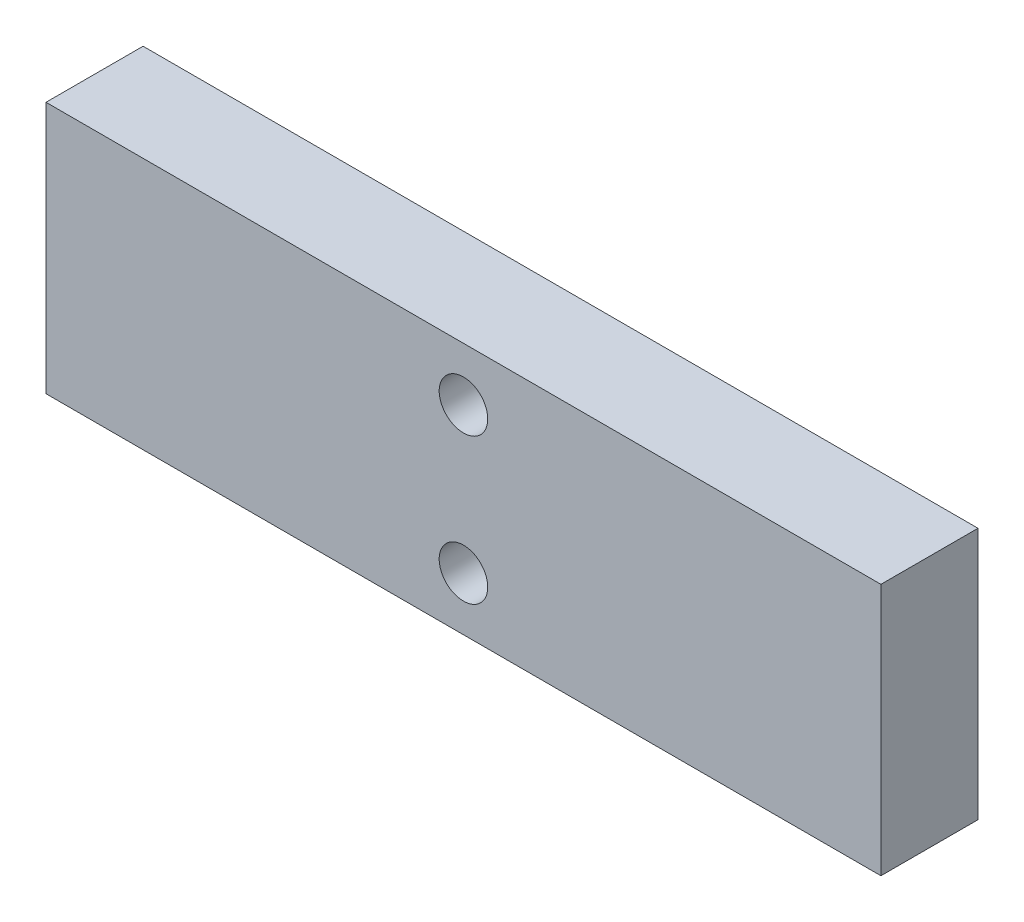
ISO-10303-21;
HEADER;
FILE_DESCRIPTION(('STEP AP214'),'2;1');
FILE_NAME('part.step','',(''),(''),'','','');
FILE_SCHEMA(('AUTOMOTIVE_DESIGN { 1 0 10303 214 1 1 1 1 }'));
ENDSEC;
DATA;
#1=APPLICATION_CONTEXT('core data for automotive mechanical design processes');
#2=APPLICATION_PROTOCOL_DEFINITION('international standard','automotive_design',2000,#1);
#3=PRODUCT_CONTEXT('',#1,'mechanical');
#4=PRODUCT('Part','Part','',(#3));
#5=PRODUCT_RELATED_PRODUCT_CATEGORY('part','',(#4));
#6=PRODUCT_DEFINITION_FORMATION('','',#4);
#7=PRODUCT_DEFINITION_CONTEXT('part definition',#1,'design');
#8=PRODUCT_DEFINITION('design','',#6,#7);
#9=PRODUCT_DEFINITION_SHAPE('','',#8);
#10=(LENGTH_UNIT() NAMED_UNIT(*) SI_UNIT(.MILLI.,.METRE.));
#11=(NAMED_UNIT(*) PLANE_ANGLE_UNIT() SI_UNIT($,.RADIAN.));
#12=(NAMED_UNIT(*) SI_UNIT($,.STERADIAN.) SOLID_ANGLE_UNIT());
#13=UNCERTAINTY_MEASURE_WITH_UNIT(LENGTH_MEASURE(1.E-05),#10,'distance_accuracy_value','');
#14=(GEOMETRIC_REPRESENTATION_CONTEXT(3) GLOBAL_UNCERTAINTY_ASSIGNED_CONTEXT((#13)) GLOBAL_UNIT_ASSIGNED_CONTEXT((#10,
#11,#12)) REPRESENTATION_CONTEXT('',''));
#15=CARTESIAN_POINT('',(0.,0.,0.));
#16=DIRECTION('',(0.,0.,1.));
#17=DIRECTION('',(1.,0.,0.));
#18=AXIS2_PLACEMENT_3D('',#15,#16,#17);
#19=CARTESIAN_POINT('',(0.,0.,10.));
#20=DIRECTION('',(0.,0.,-1.));
#21=DIRECTION('',(-1.,0.,0.));
#22=AXIS2_PLACEMENT_3D('',#19,#20,#21);
#23=PLANE('',#22);
#24=DIRECTION('',(0.,1.,0.));
#25=VECTOR('',#24,1.);
#26=CARTESIAN_POINT('',(43.,-13.,10.));
#27=LINE('',#26,#25);
#28=CARTESIAN_POINT('',(43.,-13.,10.));
#29=VERTEX_POINT('',#28);
#30=CARTESIAN_POINT('',(43.,13.,10.));
#31=VERTEX_POINT('',#30);
#32=EDGE_CURVE('E86',#29,#31,#27,.T.);
#33=ORIENTED_EDGE('',*,*,#32,.T.);
#34=DIRECTION('',(-1.,0.,0.));
#35=VECTOR('',#34,1.);
#36=CARTESIAN_POINT('',(-43.,13.,10.));
#37=LINE('',#36,#35);
#38=CARTESIAN_POINT('',(-43.,13.,10.));
#39=VERTEX_POINT('',#38);
#40=EDGE_CURVE('E81',#31,#39,#37,.T.);
#41=ORIENTED_EDGE('',*,*,#40,.T.);
#42=DIRECTION('',(0.,-1.,0.));
#43=VECTOR('',#42,1.);
#44=CARTESIAN_POINT('',(-43.,-13.,10.));
#45=LINE('',#44,#43);
#46=CARTESIAN_POINT('',(-43.,-13.,10.));
#47=VERTEX_POINT('',#46);
#48=EDGE_CURVE('E84',#39,#47,#45,.T.);
#49=ORIENTED_EDGE('',*,*,#48,.T.);
#50=DIRECTION('',(1.,0.,0.));
#51=VECTOR('',#50,1.);
#52=CARTESIAN_POINT('',(-43.,-13.,10.));
#53=LINE('',#52,#51);
#54=EDGE_CURVE('E51',#47,#29,#53,.T.);
#55=ORIENTED_EDGE('',*,*,#54,.T.);
#56=EDGE_LOOP('',(#33,#41,#49,#55));
#57=FACE_BOUND('',#56,.T.);
#58=CARTESIAN_POINT('',(0.,7.5,10.));
#59=DIRECTION('',(0.,0.,1.));
#60=DIRECTION('',(1.,0.,0.));
#61=AXIS2_PLACEMENT_3D('',#58,#59,#60);
#62=CIRCLE('',#61,2.5);
#63=CARTESIAN_POINT('',(2.5,7.5,10.));
#64=VERTEX_POINT('',#63);
#65=EDGE_CURVE('E101',#64,#64,#62,.T.);
#66=ORIENTED_EDGE('',*,*,#65,.F.);
#67=EDGE_LOOP('',(#66));
#68=FACE_BOUND('',#67,.T.);
#69=CARTESIAN_POINT('',(0.,-7.5,10.));
#70=DIRECTION('',(0.,0.,1.));
#71=DIRECTION('',(1.,0.,0.));
#72=AXIS2_PLACEMENT_3D('',#69,#70,#71);
#73=CIRCLE('',#72,2.5);
#74=CARTESIAN_POINT('',(2.5,-7.5,10.));
#75=VERTEX_POINT('',#74);
#76=EDGE_CURVE('E116',#75,#75,#73,.T.);
#77=ORIENTED_EDGE('',*,*,#76,.F.);
#78=EDGE_LOOP('',(#77));
#79=FACE_BOUND('',#78,.T.);
#80=ADVANCED_FACE('F34',(#57,#68,#79),#23,.F.);
#81=CARTESIAN_POINT('',(0.,0.,0.));
#82=DIRECTION('',(0.,0.,-1.));
#83=DIRECTION('',(-1.,0.,0.));
#84=AXIS2_PLACEMENT_3D('',#81,#82,#83);
#85=PLANE('',#84);
#86=CARTESIAN_POINT('',(0.,7.5,0.));
#87=DIRECTION('',(0.,0.,1.));
#88=DIRECTION('',(1.,0.,0.));
#89=AXIS2_PLACEMENT_3D('',#86,#87,#88);
#90=CIRCLE('',#89,2.5);
#91=CARTESIAN_POINT('',(2.5,7.5,0.));
#92=VERTEX_POINT('',#91);
#93=EDGE_CURVE('E113',#92,#92,#90,.T.);
#94=ORIENTED_EDGE('',*,*,#93,.T.);
#95=EDGE_LOOP('',(#94));
#96=FACE_BOUND('',#95,.T.);
#97=DIRECTION('',(0.,1.,0.));
#98=VECTOR('',#97,1.);
#99=CARTESIAN_POINT('',(43.,-13.,0.));
#100=LINE('',#99,#98);
#101=CARTESIAN_POINT('',(43.,-13.,0.));
#102=VERTEX_POINT('',#101);
#103=CARTESIAN_POINT('',(43.,13.,0.));
#104=VERTEX_POINT('',#103);
#105=EDGE_CURVE('E98',#102,#104,#100,.T.);
#106=ORIENTED_EDGE('',*,*,#105,.F.);
#107=DIRECTION('',(1.,0.,0.));
#108=VECTOR('',#107,1.);
#109=CARTESIAN_POINT('',(-43.,-13.,0.));
#110=LINE('',#109,#108);
#111=CARTESIAN_POINT('',(-43.,-13.,0.));
#112=VERTEX_POINT('',#111);
#113=EDGE_CURVE('E74',#112,#102,#110,.T.);
#114=ORIENTED_EDGE('',*,*,#113,.F.);
#115=DIRECTION('',(0.,-1.,0.));
#116=VECTOR('',#115,1.);
#117=CARTESIAN_POINT('',(-43.,-13.,0.));
#118=LINE('',#117,#116);
#119=CARTESIAN_POINT('',(-43.,13.,0.));
#120=VERTEX_POINT('',#119);
#121=EDGE_CURVE('E68',#120,#112,#118,.T.);
#122=ORIENTED_EDGE('',*,*,#121,.F.);
#123=DIRECTION('',(-1.,0.,0.));
#124=VECTOR('',#123,1.);
#125=CARTESIAN_POINT('',(-43.,13.,0.));
#126=LINE('',#125,#124);
#127=EDGE_CURVE('E90',#104,#120,#126,.T.);
#128=ORIENTED_EDGE('',*,*,#127,.F.);
#129=EDGE_LOOP('',(#106,#114,#122,#128));
#130=FACE_BOUND('',#129,.T.);
#131=CARTESIAN_POINT('',(0.,-7.5,0.));
#132=DIRECTION('',(0.,0.,1.));
#133=DIRECTION('',(1.,0.,0.));
#134=AXIS2_PLACEMENT_3D('',#131,#132,#133);
#135=CIRCLE('',#134,2.5);
#136=CARTESIAN_POINT('',(2.5,-7.5,0.));
#137=VERTEX_POINT('',#136);
#138=EDGE_CURVE('E119',#137,#137,#135,.T.);
#139=ORIENTED_EDGE('',*,*,#138,.T.);
#140=EDGE_LOOP('',(#139));
#141=FACE_BOUND('',#140,.T.);
#142=ADVANCED_FACE('F109',(#96,#130,#141),#85,.T.);
#143=CARTESIAN_POINT('',(43.,-13.,10.));
#144=DIRECTION('',(-1.,0.,0.));
#145=DIRECTION('',(0.,0.,1.));
#146=AXIS2_PLACEMENT_3D('',#143,#144,#145);
#147=PLANE('',#146);
#148=ORIENTED_EDGE('',*,*,#105,.T.);
#149=DIRECTION('',(0.,0.,-1.));
#150=VECTOR('',#149,1.);
#151=CARTESIAN_POINT('',(43.,13.,10.));
#152=LINE('',#151,#150);
#153=EDGE_CURVE('E11',#31,#104,#152,.T.);
#154=ORIENTED_EDGE('',*,*,#153,.F.);
#155=ORIENTED_EDGE('',*,*,#32,.F.);
#156=DIRECTION('',(0.,0.,-1.));
#157=VECTOR('',#156,1.);
#158=CARTESIAN_POINT('',(43.,-13.,10.));
#159=LINE('',#158,#157);
#160=EDGE_CURVE('E94',#29,#102,#159,.T.);
#161=ORIENTED_EDGE('',*,*,#160,.T.);
#162=EDGE_LOOP('',(#148,#154,#155,#161));
#163=FACE_BOUND('',#162,.T.);
#164=ADVANCED_FACE('F36',(#163),#147,.F.);
#165=CARTESIAN_POINT('',(-43.,13.,10.));
#166=DIRECTION('',(0.,-1.,0.));
#167=DIRECTION('',(0.,0.,-1.));
#168=AXIS2_PLACEMENT_3D('',#165,#166,#167);
#169=PLANE('',#168);
#170=ORIENTED_EDGE('',*,*,#127,.T.);
#171=DIRECTION('',(0.,0.,-1.));
#172=VECTOR('',#171,1.);
#173=CARTESIAN_POINT('',(-43.,13.,10.));
#174=LINE('',#173,#172);
#175=EDGE_CURVE('E43',#39,#120,#174,.T.);
#176=ORIENTED_EDGE('',*,*,#175,.F.);
#177=ORIENTED_EDGE('',*,*,#40,.F.);
#178=ORIENTED_EDGE('',*,*,#153,.T.);
#179=EDGE_LOOP('',(#170,#176,#177,#178));
#180=FACE_BOUND('',#179,.T.);
#181=ADVANCED_FACE('F89',(#180),#169,.F.);
#182=CARTESIAN_POINT('',(-43.,-13.,10.));
#183=DIRECTION('',(1.,0.,0.));
#184=DIRECTION('',(0.,0.,-1.));
#185=AXIS2_PLACEMENT_3D('',#182,#183,#184);
#186=PLANE('',#185);
#187=ORIENTED_EDGE('',*,*,#121,.T.);
#188=DIRECTION('',(0.,0.,-1.));
#189=VECTOR('',#188,1.);
#190=CARTESIAN_POINT('',(-43.,-13.,10.));
#191=LINE('',#190,#189);
#192=EDGE_CURVE('E91',#47,#112,#191,.T.);
#193=ORIENTED_EDGE('',*,*,#192,.F.);
#194=ORIENTED_EDGE('',*,*,#48,.F.);
#195=ORIENTED_EDGE('',*,*,#175,.T.);
#196=EDGE_LOOP('',(#187,#193,#194,#195));
#197=FACE_BOUND('',#196,.T.);
#198=ADVANCED_FACE('F92',(#197),#186,.F.);
#199=CARTESIAN_POINT('',(-43.,-13.,10.));
#200=DIRECTION('',(0.,1.,0.));
#201=DIRECTION('',(0.,0.,1.));
#202=AXIS2_PLACEMENT_3D('',#199,#200,#201);
#203=PLANE('',#202);
#204=ORIENTED_EDGE('',*,*,#113,.T.);
#205=ORIENTED_EDGE('',*,*,#160,.F.);
#206=ORIENTED_EDGE('',*,*,#54,.F.);
#207=ORIENTED_EDGE('',*,*,#192,.T.);
#208=EDGE_LOOP('',(#204,#205,#206,#207));
#209=FACE_BOUND('',#208,.T.);
#210=ADVANCED_FACE('F106',(#209),#203,.F.);
#211=CARTESIAN_POINT('',(0.,7.5,10.));
#212=DIRECTION('',(0.,0.,-1.));
#213=DIRECTION('',(-1.,0.,0.));
#214=AXIS2_PLACEMENT_3D('',#211,#212,#213);
#215=CYLINDRICAL_SURFACE('',#214,2.5);
#216=ORIENTED_EDGE('',*,*,#65,.T.);
#217=EDGE_LOOP('',(#216));
#218=FACE_BOUND('',#217,.T.);
#219=ORIENTED_EDGE('',*,*,#93,.F.);
#220=EDGE_LOOP('',(#219));
#221=FACE_BOUND('',#220,.T.);
#222=ADVANCED_FACE('F136',(#218,#221),#215,.F.);
#223=CARTESIAN_POINT('',(0.,-7.5,10.));
#224=DIRECTION('',(0.,0.,-1.));
#225=DIRECTION('',(-1.,0.,0.));
#226=AXIS2_PLACEMENT_3D('',#223,#224,#225);
#227=CYLINDRICAL_SURFACE('',#226,2.5);
#228=ORIENTED_EDGE('',*,*,#76,.T.);
#229=EDGE_LOOP('',(#228));
#230=FACE_BOUND('',#229,.T.);
#231=ORIENTED_EDGE('',*,*,#138,.F.);
#232=EDGE_LOOP('',(#231));
#233=FACE_BOUND('',#232,.T.);
#234=ADVANCED_FACE('F125',(#230,#233),#227,.F.);
#235=CLOSED_SHELL('',(#80,#142,#164,#181,#198,#210,#222,#234));
#236=MANIFOLD_SOLID_BREP('B2',#235);
#237=ADVANCED_BREP_SHAPE_REPRESENTATION('',(#18,#236),#14);
#238=SHAPE_DEFINITION_REPRESENTATION(#9,#237);
ENDSEC;
END-ISO-10303-21;
